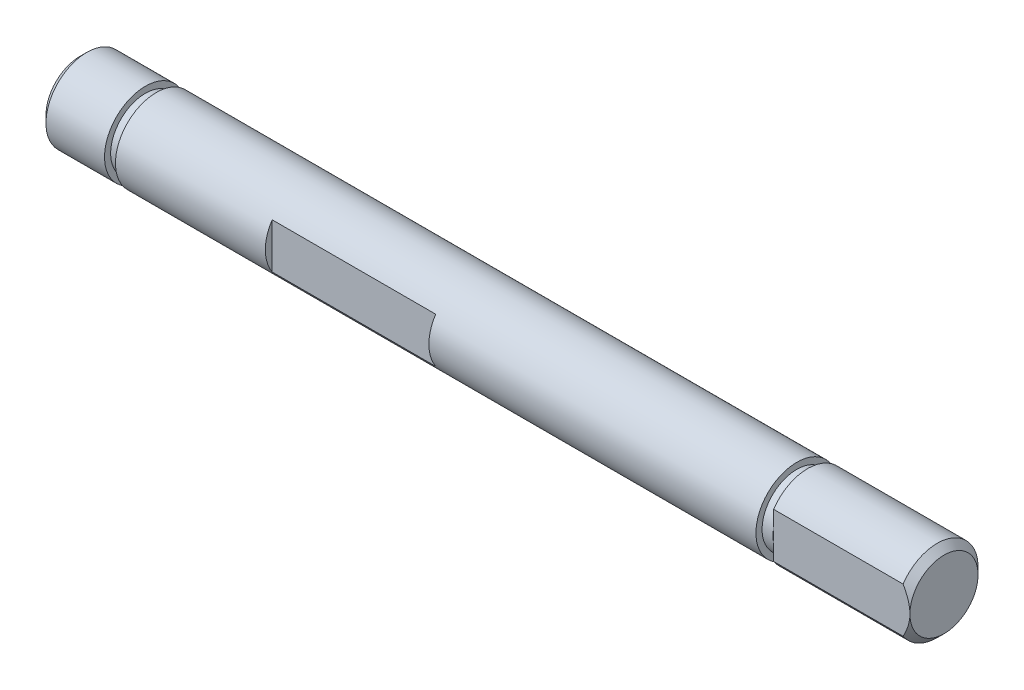
ISO-10303-21;
HEADER;
FILE_DESCRIPTION(('STEP AP214'),'2;1');
FILE_NAME('part.step','',(''),(''),'','','');
FILE_SCHEMA(('AUTOMOTIVE_DESIGN { 1 0 10303 214 1 1 1 1 }'));
ENDSEC;
DATA;
#1=APPLICATION_CONTEXT('core data for automotive mechanical design processes');
#2=APPLICATION_PROTOCOL_DEFINITION('international standard','automotive_design',2000,#1);
#3=PRODUCT_CONTEXT('',#1,'mechanical');
#4=PRODUCT('Part','Part','',(#3));
#5=PRODUCT_RELATED_PRODUCT_CATEGORY('part','',(#4));
#6=PRODUCT_DEFINITION_FORMATION('','',#4);
#7=PRODUCT_DEFINITION_CONTEXT('part definition',#1,'design');
#8=PRODUCT_DEFINITION('design','',#6,#7);
#9=PRODUCT_DEFINITION_SHAPE('','',#8);
#10=(LENGTH_UNIT() NAMED_UNIT(*) SI_UNIT(.MILLI.,.METRE.));
#11=(NAMED_UNIT(*) PLANE_ANGLE_UNIT() SI_UNIT($,.RADIAN.));
#12=(NAMED_UNIT(*) SI_UNIT($,.STERADIAN.) SOLID_ANGLE_UNIT());
#13=UNCERTAINTY_MEASURE_WITH_UNIT(LENGTH_MEASURE(1.E-05),#10,'distance_accuracy_value','');
#14=(GEOMETRIC_REPRESENTATION_CONTEXT(3) GLOBAL_UNCERTAINTY_ASSIGNED_CONTEXT((#13)) GLOBAL_UNIT_ASSIGNED_CONTEXT((#10,
#11,#12)) REPRESENTATION_CONTEXT('',''));
#15=CARTESIAN_POINT('',(0.,0.,0.));
#16=DIRECTION('',(0.,0.,1.));
#17=DIRECTION('',(1.,0.,0.));
#18=AXIS2_PLACEMENT_3D('',#15,#16,#17);
#19=CARTESIAN_POINT('',(31.7,0.,0.));
#20=DIRECTION('',(1.,0.,0.));
#21=DIRECTION('',(0.,0.,-1.));
#22=AXIS2_PLACEMENT_3D('',#19,#20,#21);
#23=CYLINDRICAL_SURFACE('',#22,3.);
#24=CARTESIAN_POINT('',(-26.1,0.,0.));
#25=DIRECTION('',(1.,0.,0.));
#26=DIRECTION('',(0.,0.,-1.));
#27=AXIS2_PLACEMENT_3D('',#24,#25,#26);
#28=CIRCLE('',#27,3.);
#29=CARTESIAN_POINT('',(-26.1,0.,-3.));
#30=VERTEX_POINT('',#29);
#31=EDGE_CURVE('E136',#30,#30,#28,.T.);
#32=ORIENTED_EDGE('',*,*,#31,.T.);
#33=EDGE_LOOP('',(#32));
#34=FACE_BOUND('',#33,.T.);
#35=CARTESIAN_POINT('',(20.9,0.,0.));
#36=DIRECTION('',(1.,0.,0.));
#37=DIRECTION('',(0.,0.,-1.));
#38=AXIS2_PLACEMENT_3D('',#35,#36,#37);
#39=CIRCLE('',#38,3.);
#40=CARTESIAN_POINT('',(20.9,0.,-3.));
#41=VERTEX_POINT('',#40);
#42=EDGE_CURVE('E139',#41,#41,#39,.T.);
#43=ORIENTED_EDGE('',*,*,#42,.F.);
#44=EDGE_LOOP('',(#43));
#45=FACE_BOUND('',#44,.T.);
#46=CARTESIAN_POINT('',(-15.1,0.,0.));
#47=DIRECTION('',(1.,0.,0.));
#48=DIRECTION('',(0.,0.,-1.));
#49=AXIS2_PLACEMENT_3D('',#46,#47,#48);
#50=CIRCLE('',#49,3.);
#51=CARTESIAN_POINT('',(-15.1,1.65831239519321,2.49999999999773));
#52=VERTEX_POINT('',#51);
#53=CARTESIAN_POINT('',(-15.1,-1.65831239519321,2.49999999999773));
#54=VERTEX_POINT('',#53);
#55=EDGE_CURVE('E98',#52,#54,#50,.T.);
#56=ORIENTED_EDGE('',*,*,#55,.F.);
#57=DIRECTION('',(1.,0.,0.));
#58=VECTOR('',#57,1.);
#59=CARTESIAN_POINT('',(-15.1,1.65831239519321,2.49999999999773));
#60=LINE('',#59,#58);
#61=CARTESIAN_POINT('',(-3.1,1.65831239519321,2.49999999999773));
#62=VERTEX_POINT('',#61);
#63=EDGE_CURVE('E110',#52,#62,#60,.T.);
#64=ORIENTED_EDGE('',*,*,#63,.T.);
#65=CARTESIAN_POINT('',(-3.1,0.,0.));
#66=DIRECTION('',(1.,0.,0.));
#67=DIRECTION('',(0.,0.,-1.));
#68=AXIS2_PLACEMENT_3D('',#65,#66,#67);
#69=CIRCLE('',#68,3.);
#70=CARTESIAN_POINT('',(-3.1,-1.65831239518952,2.49999999999216));
#71=VERTEX_POINT('',#70);
#72=EDGE_CURVE('E112',#62,#71,#69,.T.);
#73=ORIENTED_EDGE('',*,*,#72,.T.);
#74=DIRECTION('',(1.,0.,0.));
#75=VECTOR('',#74,1.);
#76=CARTESIAN_POINT('',(-15.1,-1.65831239519321,2.49999999999773));
#77=LINE('',#76,#75);
#78=EDGE_CURVE('E108',#54,#71,#77,.T.);
#79=ORIENTED_EDGE('',*,*,#78,.F.);
#80=EDGE_LOOP('',(#56,#64,#73,#79));
#81=FACE_BOUND('',#80,.T.);
#82=ADVANCED_FACE('F43',(#34,#45,#81),#23,.T.);
#83=CARTESIAN_POINT('',(31.7,0.,0.));
#84=DIRECTION('',(-1.,0.,0.));
#85=DIRECTION('',(0.,0.,1.));
#86=AXIS2_PLACEMENT_3D('',#83,#84,#85);
#87=PLANE('',#86);
#88=CARTESIAN_POINT('',(31.7,0.,0.));
#89=DIRECTION('',(-1.,0.,0.));
#90=DIRECTION('',(0.,0.,1.));
#91=AXIS2_PLACEMENT_3D('',#88,#89,#90);
#92=CIRCLE('',#91,2.49999999999999);
#93=CARTESIAN_POINT('',(31.7,0.,2.49999999999999));
#94=VERTEX_POINT('',#93);
#95=EDGE_CURVE('E157',#94,#94,#92,.F.);
#96=ORIENTED_EDGE('',*,*,#95,.T.);
#97=EDGE_LOOP('',(#96));
#98=FACE_BOUND('',#97,.T.);
#99=ADVANCED_FACE('F171',(#98),#87,.F.);
#100=CARTESIAN_POINT('',(31.7,0.,0.));
#101=DIRECTION('',(1.,0.,0.));
#102=DIRECTION('',(0.,0.,-1.));
#103=AXIS2_PLACEMENT_3D('',#100,#101,#102);
#104=CYLINDRICAL_SURFACE('',#103,3.);
#105=CARTESIAN_POINT('',(21.7,0.,0.));
#106=DIRECTION('',(1.,0.,0.));
#107=DIRECTION('',(0.,0.,-1.));
#108=AXIS2_PLACEMENT_3D('',#105,#106,#107);
#109=CIRCLE('',#108,3.);
#110=CARTESIAN_POINT('',(21.7,-1.6583123951777,2.5));
#111=VERTEX_POINT('',#110);
#112=CARTESIAN_POINT('',(21.7,1.6583123951777,2.5));
#113=VERTEX_POINT('',#112);
#114=EDGE_CURVE('E148',#111,#113,#109,.T.);
#115=ORIENTED_EDGE('',*,*,#114,.T.);
#116=DIRECTION('',(1.,0.,0.));
#117=VECTOR('',#116,1.);
#118=CARTESIAN_POINT('',(18.3458980337503,1.6583123951777,2.5));
#119=LINE('',#118,#117);
#120=CARTESIAN_POINT('',(31.2,1.6583123951777,2.5));
#121=VERTEX_POINT('',#120);
#122=EDGE_CURVE('E118',#113,#121,#119,.T.);
#123=ORIENTED_EDGE('',*,*,#122,.T.);
#124=CARTESIAN_POINT('',(31.2,0.,0.));
#125=DIRECTION('',(-1.,0.,0.));
#126=DIRECTION('',(0.,0.,1.));
#127=AXIS2_PLACEMENT_3D('',#124,#125,#126);
#128=CIRCLE('',#127,3.);
#129=CARTESIAN_POINT('',(31.2,-1.6583123951777,2.5));
#130=VERTEX_POINT('',#129);
#131=EDGE_CURVE('E159',#121,#130,#128,.T.);
#132=ORIENTED_EDGE('',*,*,#131,.T.);
#133=DIRECTION('',(1.,0.,0.));
#134=VECTOR('',#133,1.);
#135=CARTESIAN_POINT('',(18.3458980337503,-1.6583123951777,2.5));
#136=LINE('',#135,#134);
#137=EDGE_CURVE('E114',#111,#130,#136,.T.);
#138=ORIENTED_EDGE('',*,*,#137,.F.);
#139=EDGE_LOOP('',(#115,#123,#132,#138));
#140=FACE_BOUND('',#139,.T.);
#141=ADVANCED_FACE('F168',(#140),#104,.T.);
#142=CARTESIAN_POINT('',(21.7,0.,3.));
#143=DIRECTION('',(1.,0.,0.));
#144=DIRECTION('',(0.,0.,-1.));
#145=AXIS2_PLACEMENT_3D('',#142,#143,#144);
#146=PLANE('',#145);
#147=ORIENTED_EDGE('',*,*,#114,.F.);
#148=DIRECTION('',(0.,-1.,0.));
#149=VECTOR('',#148,1.);
#150=CARTESIAN_POINT('',(21.7,1.6583123951777,2.5));
#151=LINE('',#150,#149);
#152=CARTESIAN_POINT('',(21.7,-0.502493781056048,2.5));
#153=VERTEX_POINT('',#152);
#154=EDGE_CURVE('E121',#153,#111,#151,.T.);
#155=ORIENTED_EDGE('',*,*,#154,.F.);
#156=CARTESIAN_POINT('',(21.7,0.,0.));
#157=DIRECTION('',(1.,0.,0.));
#158=DIRECTION('',(0.,0.,-1.));
#159=AXIS2_PLACEMENT_3D('',#156,#157,#158);
#160=CIRCLE('',#159,2.55);
#161=CARTESIAN_POINT('',(21.7,0.502493781056048,2.5));
#162=VERTEX_POINT('',#161);
#163=EDGE_CURVE('E145',#153,#162,#160,.T.);
#164=ORIENTED_EDGE('',*,*,#163,.T.);
#165=EDGE_CURVE('E123',#113,#162,#151,.T.);
#166=ORIENTED_EDGE('',*,*,#165,.F.);
#167=EDGE_LOOP('',(#147,#155,#164,#166));
#168=FACE_BOUND('',#167,.T.);
#169=ADVANCED_FACE('F178',(#168),#146,.F.);
#170=CARTESIAN_POINT('',(31.7,0.,0.));
#171=DIRECTION('',(1.,0.,0.));
#172=DIRECTION('',(0.,0.,-1.));
#173=AXIS2_PLACEMENT_3D('',#170,#171,#172);
#174=CYLINDRICAL_SURFACE('',#173,2.55);
#175=EDGE_CURVE('E146',#162,#153,#160,.T.);
#176=ORIENTED_EDGE('',*,*,#175,.F.);
#177=ORIENTED_EDGE('',*,*,#163,.F.);
#178=EDGE_LOOP('',(#176,#177));
#179=FACE_BOUND('',#178,.T.);
#180=CARTESIAN_POINT('',(20.9,0.,0.));
#181=DIRECTION('',(1.,0.,0.));
#182=DIRECTION('',(0.,0.,-1.));
#183=AXIS2_PLACEMENT_3D('',#180,#181,#182);
#184=CIRCLE('',#183,2.55);
#185=CARTESIAN_POINT('',(20.9,0.,-2.55));
#186=VERTEX_POINT('',#185);
#187=EDGE_CURVE('E142',#186,#186,#184,.T.);
#188=ORIENTED_EDGE('',*,*,#187,.T.);
#189=EDGE_LOOP('',(#188));
#190=FACE_BOUND('',#189,.T.);
#191=ADVANCED_FACE('F226',(#179,#190),#174,.T.);
#192=CARTESIAN_POINT('',(20.9,0.,2.55));
#193=DIRECTION('',(-1.,0.,0.));
#194=DIRECTION('',(0.,0.,1.));
#195=AXIS2_PLACEMENT_3D('',#192,#193,#194);
#196=PLANE('',#195);
#197=ORIENTED_EDGE('',*,*,#187,.F.);
#198=EDGE_LOOP('',(#197));
#199=FACE_BOUND('',#198,.T.);
#200=ORIENTED_EDGE('',*,*,#42,.T.);
#201=EDGE_LOOP('',(#200));
#202=FACE_BOUND('',#201,.T.);
#203=ADVANCED_FACE('F221',(#199,#202),#196,.F.);
#204=CARTESIAN_POINT('',(-26.1,0.,3.));
#205=DIRECTION('',(1.,0.,0.));
#206=DIRECTION('',(0.,0.,-1.));
#207=AXIS2_PLACEMENT_3D('',#204,#205,#206);
#208=PLANE('',#207);
#209=ORIENTED_EDGE('',*,*,#31,.F.);
#210=EDGE_LOOP('',(#209));
#211=FACE_BOUND('',#210,.T.);
#212=CARTESIAN_POINT('',(-26.1,0.,0.));
#213=DIRECTION('',(1.,0.,0.));
#214=DIRECTION('',(0.,0.,-1.));
#215=AXIS2_PLACEMENT_3D('',#212,#213,#214);
#216=CIRCLE('',#215,2.55);
#217=CARTESIAN_POINT('',(-26.1,0.,-2.55));
#218=VERTEX_POINT('',#217);
#219=EDGE_CURVE('E133',#218,#218,#216,.T.);
#220=ORIENTED_EDGE('',*,*,#219,.T.);
#221=EDGE_LOOP('',(#220));
#222=FACE_BOUND('',#221,.T.);
#223=ADVANCED_FACE('F215',(#211,#222),#208,.F.);
#224=CARTESIAN_POINT('',(31.7,0.,0.));
#225=DIRECTION('',(1.,0.,0.));
#226=DIRECTION('',(0.,0.,-1.));
#227=AXIS2_PLACEMENT_3D('',#224,#225,#226);
#228=CYLINDRICAL_SURFACE('',#227,2.55);
#229=ORIENTED_EDGE('',*,*,#219,.F.);
#230=EDGE_LOOP('',(#229));
#231=FACE_BOUND('',#230,.T.);
#232=CARTESIAN_POINT('',(-26.9,0.,0.));
#233=DIRECTION('',(1.,0.,0.));
#234=DIRECTION('',(0.,0.,-1.));
#235=AXIS2_PLACEMENT_3D('',#232,#233,#234);
#236=CIRCLE('',#235,2.55);
#237=CARTESIAN_POINT('',(-26.9,0.,-2.55));
#238=VERTEX_POINT('',#237);
#239=EDGE_CURVE('E130',#238,#238,#236,.T.);
#240=ORIENTED_EDGE('',*,*,#239,.T.);
#241=EDGE_LOOP('',(#240));
#242=FACE_BOUND('',#241,.T.);
#243=ADVANCED_FACE('F209',(#231,#242),#228,.T.);
#244=CARTESIAN_POINT('',(-26.9,0.,2.55));
#245=DIRECTION('',(-1.,0.,0.));
#246=DIRECTION('',(0.,0.,1.));
#247=AXIS2_PLACEMENT_3D('',#244,#245,#246);
#248=PLANE('',#247);
#249=ORIENTED_EDGE('',*,*,#239,.F.);
#250=EDGE_LOOP('',(#249));
#251=FACE_BOUND('',#250,.T.);
#252=CARTESIAN_POINT('',(-26.9,0.,0.));
#253=DIRECTION('',(1.,0.,0.));
#254=DIRECTION('',(0.,0.,-1.));
#255=AXIS2_PLACEMENT_3D('',#252,#253,#254);
#256=CIRCLE('',#255,3.);
#257=CARTESIAN_POINT('',(-26.9,0.,-3.));
#258=VERTEX_POINT('',#257);
#259=EDGE_CURVE('E126',#258,#258,#256,.T.);
#260=ORIENTED_EDGE('',*,*,#259,.T.);
#261=EDGE_LOOP('',(#260));
#262=FACE_BOUND('',#261,.T.);
#263=ADVANCED_FACE('F204',(#251,#262),#248,.F.);
#264=CARTESIAN_POINT('',(31.7,0.,0.));
#265=DIRECTION('',(1.,0.,0.));
#266=DIRECTION('',(0.,0.,-1.));
#267=AXIS2_PLACEMENT_3D('',#264,#265,#266);
#268=CYLINDRICAL_SURFACE('',#267,3.);
#269=CARTESIAN_POINT('',(-31.2,0.,0.));
#270=DIRECTION('',(1.,0.,0.));
#271=DIRECTION('',(0.,0.,-1.));
#272=AXIS2_PLACEMENT_3D('',#269,#270,#271);
#273=CIRCLE('',#272,3.);
#274=CARTESIAN_POINT('',(-31.2,0.,-3.));
#275=VERTEX_POINT('',#274);
#276=EDGE_CURVE('E151',#275,#275,#273,.T.);
#277=ORIENTED_EDGE('',*,*,#276,.T.);
#278=EDGE_LOOP('',(#277));
#279=FACE_BOUND('',#278,.T.);
#280=ORIENTED_EDGE('',*,*,#259,.F.);
#281=EDGE_LOOP('',(#280));
#282=FACE_BOUND('',#281,.T.);
#283=ADVANCED_FACE('F195',(#279,#282),#268,.T.);
#284=CARTESIAN_POINT('',(-31.7,0.,3.));
#285=DIRECTION('',(1.,0.,0.));
#286=DIRECTION('',(0.,0.,-1.));
#287=AXIS2_PLACEMENT_3D('',#284,#285,#286);
#288=PLANE('',#287);
#289=CARTESIAN_POINT('',(-31.7,0.,0.));
#290=DIRECTION('',(1.,0.,0.));
#291=DIRECTION('',(0.,0.,-1.));
#292=AXIS2_PLACEMENT_3D('',#289,#290,#291);
#293=CIRCLE('',#292,2.49999999999999);
#294=CARTESIAN_POINT('',(-31.7,0.,-2.49999999999999));
#295=VERTEX_POINT('',#294);
#296=EDGE_CURVE('E154',#295,#295,#293,.F.);
#297=ORIENTED_EDGE('',*,*,#296,.T.);
#298=EDGE_LOOP('',(#297));
#299=FACE_BOUND('',#298,.T.);
#300=ADVANCED_FACE('F188',(#299),#288,.F.);
#301=CARTESIAN_POINT('',(-31.2,0.,0.));
#302=DIRECTION('',(1.,0.,0.));
#303=DIRECTION('',(0.,0.,-1.));
#304=AXIS2_PLACEMENT_3D('',#301,#302,#303);
#305=CONICAL_SURFACE('',#304,3.,0.785398163397446);
#306=ORIENTED_EDGE('',*,*,#296,.F.);
#307=EDGE_LOOP('',(#306));
#308=FACE_BOUND('',#307,.T.);
#309=ORIENTED_EDGE('',*,*,#276,.F.);
#310=EDGE_LOOP('',(#309));
#311=FACE_BOUND('',#310,.T.);
#312=ADVANCED_FACE('F185',(#308,#311),#305,.T.);
#313=CARTESIAN_POINT('',(31.7,0.,0.));
#314=DIRECTION('',(-1.,0.,0.));
#315=DIRECTION('',(0.,0.,1.));
#316=AXIS2_PLACEMENT_3D('',#313,#314,#315);
#317=CONICAL_SURFACE('',#316,2.49999999999999,0.785398163397453);
#318=CARTESIAN_POINT('',(28.598544587664,-5.01261436142739,2.5));
#319=CARTESIAN_POINT('',(28.7292961898362,-4.86645601073501,2.5));
#320=CARTESIAN_POINT('',(28.8594638313863,-4.71976739212954,2.5));
#321=CARTESIAN_POINT('',(29.1182043366285,-4.42490323608813,2.5));
#322=CARTESIAN_POINT('',(29.2467766411769,-4.27672720851474,2.5));
#323=CARTESIAN_POINT('',(29.5032395004087,-3.97688951525237,2.5));
#324=CARTESIAN_POINT('',(29.6311062482402,-3.82520739562326,2.5));
#325=CARTESIAN_POINT('',(29.8206791885024,-3.59587157248299,2.5));
#326=CARTESIAN_POINT('',(29.883492074651,-3.51913287021473,2.5));
#327=CARTESIAN_POINT('',(30.0082494078658,-3.36494027001332,2.5));
#328=CARTESIAN_POINT('',(30.070193765036,-3.28748629940352,2.5));
#329=CARTESIAN_POINT('',(30.2460483302526,-3.06459082343302,2.5));
#330=CARTESIAN_POINT('',(30.3586894981081,-2.91813907352298,2.5));
#331=CARTESIAN_POINT('',(30.5788996641048,-2.62149769559911,2.5));
#332=CARTESIAN_POINT('',(30.6864696419384,-2.47130879819322,2.5));
#333=CARTESIAN_POINT('',(30.8940169575575,-2.16612182513485,2.5));
#334=CARTESIAN_POINT('',(30.9940093878101,-2.01113422400727,2.5));
#335=CARTESIAN_POINT('',(31.1354107270732,-1.77361367684957,2.5));
#336=CARTESIAN_POINT('',(31.1810970794498,-1.69363260464487,2.5));
#337=CARTESIAN_POINT('',(31.2688677372138,-1.53172298488916,2.5));
#338=CARTESIAN_POINT('',(31.3109528053295,-1.44979485443235,2.5));
#339=CARTESIAN_POINT('',(31.3878183587141,-1.28955485758684,2.5));
#340=CARTESIAN_POINT('',(31.4229037691546,-1.21139031158101,2.5));
#341=CARTESIAN_POINT('',(31.488230570901,-1.05304035275104,2.5));
#342=CARTESIAN_POINT('',(31.5184719361588,-0.972854929062609,2.5));
#343=CARTESIAN_POINT('',(31.5729031977163,-0.810820527838519,2.5));
#344=CARTESIAN_POINT('',(31.5971190319419,-0.728980380152396,2.5));
#345=CARTESIAN_POINT('',(31.6385195500288,-0.563547709814035,2.5));
#346=CARTESIAN_POINT('',(31.6557071011351,-0.479955916420191,2.5));
#347=CARTESIAN_POINT('',(31.6822646083775,-0.310064383761517,2.5));
#348=CARTESIAN_POINT('',(31.6914974735762,-0.223742755772615,2.5));
#349=CARTESIAN_POINT('',(31.7009812764121,-0.0506093366638322,2.5));
#350=CARTESIAN_POINT('',(31.7012334603241,0.0362023847720708,2.5));
#351=CARTESIAN_POINT('',(31.6927321484853,0.209521762519747,2.5));
#352=CARTESIAN_POINT('',(31.6839634825484,0.296028660341596,2.5));
#353=CARTESIAN_POINT('',(31.6580338915021,0.467771425777416,2.5));
#354=CARTESIAN_POINT('',(31.6408705066054,0.553006913299571,2.5));
#355=CARTESIAN_POINT('',(31.5938594777731,0.743317468333404,2.5));
#356=CARTESIAN_POINT('',(31.5618857477942,0.847862483412583,2.5));
#357=CARTESIAN_POINT('',(31.4887422005432,1.05365832245568,2.5));
#358=CARTESIAN_POINT('',(31.4475678392535,1.15490749025714,2.5));
#359=CARTESIAN_POINT('',(31.357667077102,1.35535095839278,2.5));
#360=CARTESIAN_POINT('',(31.3088593227963,1.45450827052738,2.5));
#361=CARTESIAN_POINT('',(31.2058001956105,1.64988097548432,2.5));
#362=CARTESIAN_POINT('',(31.1515503446907,1.74609718106266,2.5));
#363=CARTESIAN_POINT('',(31.0060900856273,1.99142704465457,2.5));
#364=CARTESIAN_POINT('',(30.911766898266,2.13868543535042,2.5));
#365=CARTESIAN_POINT('',(30.7162335666569,2.42858701671763,2.5));
#366=CARTESIAN_POINT('',(30.615019822545,2.57122773664616,2.5));
#367=CARTESIAN_POINT('',(30.4076005635745,2.85332108896268,2.5));
#368=CARTESIAN_POINT('',(30.3013840508022,2.99276558976203,2.5));
#369=CARTESIAN_POINT('',(30.0855313873053,3.26898529959988,2.5));
#370=CARTESIAN_POINT('',(29.9758949548956,3.40576028724498,2.5));
#371=CARTESIAN_POINT('',(29.7623603367655,3.66713566496969,2.5));
#372=CARTESIAN_POINT('',(29.6586428413258,3.79188417485759,2.5));
#373=CARTESIAN_POINT('',(29.4495294376333,4.03997782587901,2.5));
#374=CARTESIAN_POINT('',(29.3441334188187,4.1633228736435,2.5));
#375=CARTESIAN_POINT('',(29.1326215107457,4.40818765481887,2.5));
#376=CARTESIAN_POINT('',(29.0265129639386,4.52971374327954,2.5));
#377=CARTESIAN_POINT('',(28.8132532405992,4.77182042249177,2.5));
#378=CARTESIAN_POINT('',(28.7061022001604,4.89240113304366,2.5));
#379=CARTESIAN_POINT('',(28.598544587664,5.01261436142739,2.5));
#380=B_SPLINE_CURVE_WITH_KNOTS('',3,(#318,#319,#320,#321,#322,#323,#324,#325,#326,#327,#328,
#329,#330,#331,#332,#333,#334,#335,#336,#337,#338,#339,#340,#341,#342,#343,#344,#345,#346,#347,
#348,#349,#350,#351,#352,#353,#354,#355,#356,#357,#358,#359,#360,#361,#362,#363,#364,#365,#366,
#367,#368,#369,#370,#371,#372,#373,#374,#375,#376,#377,#378,#379),.UNSPECIFIED.,.F.,.F.,(4,2,2,
2,2,2,2,2,2,2,2,2,2,2,2,2,2,2,2,2,2,2,2,2,2,2,2,2,2,2,4),(0.,0.588329986418017,1.17686065921619,
1.7719900012701,2.06948816889886,2.36701690466704,2.92121182530221,3.47529923975523,
4.02825235410285,4.30451265967421,4.58071430956077,4.83761667037549,5.09452041259713,
5.35029835461559,5.60597184559854,5.86596818653911,6.1259284469096,6.3863265931115,
6.64680108589991,6.97420780536853,7.30177658362062,7.63310993802639,7.96435088727171,
8.48865866228518,9.01324248750309,9.53903891418246,10.0648787635414,10.5515594246363,
11.0382722763362,11.5222580103924,12.006181387876),.UNSPECIFIED.);
#381=EDGE_CURVE('E11',#130,#94,#380,.T.);
#382=ORIENTED_EDGE('',*,*,#381,.F.);
#383=ORIENTED_EDGE('',*,*,#131,.F.);
#384=EDGE_CURVE('E49',#94,#121,#380,.T.);
#385=ORIENTED_EDGE('',*,*,#384,.F.);
#386=ORIENTED_EDGE('',*,*,#95,.F.);
#387=EDGE_LOOP('',(#382,#383,#385,#386));
#388=FACE_BOUND('',#387,.T.);
#389=ADVANCED_FACE('F46',(#388),#317,.T.);
#390=CARTESIAN_POINT('',(21.7,0.,3.));
#391=DIRECTION('',(1.,0.,0.));
#392=DIRECTION('',(0.,0.,-1.));
#393=AXIS2_PLACEMENT_3D('',#390,#391,#392);
#394=PLANE('',#393);
#395=ORIENTED_EDGE('',*,*,#175,.T.);
#396=EDGE_CURVE('E127',#162,#153,#151,.T.);
#397=ORIENTED_EDGE('',*,*,#396,.F.);
#398=EDGE_LOOP('',(#395,#397));
#399=FACE_BOUND('',#398,.T.);
#400=ADVANCED_FACE('F194',(#399),#394,.T.);
#401=CARTESIAN_POINT('',(18.3458980337503,1.6583123951777,2.5));
#402=DIRECTION('',(0.,0.,-1.));
#403=DIRECTION('',(-1.,0.,0.));
#404=AXIS2_PLACEMENT_3D('',#401,#402,#403);
#405=PLANE('',#404);
#406=ORIENTED_EDGE('',*,*,#381,.T.);
#407=ORIENTED_EDGE('',*,*,#384,.T.);
#408=ORIENTED_EDGE('',*,*,#122,.F.);
#409=ORIENTED_EDGE('',*,*,#165,.T.);
#410=ORIENTED_EDGE('',*,*,#396,.T.);
#411=ORIENTED_EDGE('',*,*,#154,.T.);
#412=ORIENTED_EDGE('',*,*,#137,.T.);
#413=EDGE_LOOP('',(#406,#407,#408,#409,#410,#411,#412));
#414=FACE_BOUND('',#413,.T.);
#415=ADVANCED_FACE('F164',(#414),#405,.F.);
#416=CARTESIAN_POINT('',(-15.1,-291595.6,2.49999999999773));
#417=DIRECTION('',(0.,0.,-1.));
#418=DIRECTION('',(-1.,0.,0.));
#419=AXIS2_PLACEMENT_3D('',#416,#417,#418);
#420=PLANE('',#419);
#421=DIRECTION('',(0.,1.,0.));
#422=VECTOR('',#421,1.);
#423=CARTESIAN_POINT('',(-3.1,-291595.6,2.49999999999773));
#424=LINE('',#423,#422);
#425=EDGE_CURVE('E64',#71,#62,#424,.T.);
#426=ORIENTED_EDGE('',*,*,#425,.T.);
#427=ORIENTED_EDGE('',*,*,#63,.F.);
#428=DIRECTION('',(0.,1.,0.));
#429=VECTOR('',#428,1.);
#430=CARTESIAN_POINT('',(-15.1,-291595.6,2.49999999999773));
#431=LINE('',#430,#429);
#432=EDGE_CURVE('E101',#54,#52,#431,.T.);
#433=ORIENTED_EDGE('',*,*,#432,.F.);
#434=ORIENTED_EDGE('',*,*,#78,.T.);
#435=EDGE_LOOP('',(#426,#427,#433,#434));
#436=FACE_BOUND('',#435,.T.);
#437=ADVANCED_FACE('F107',(#436),#420,.F.);
#438=CARTESIAN_POINT('',(-15.1,0.,0.));
#439=DIRECTION('',(1.,0.,0.));
#440=DIRECTION('',(0.,0.,-1.));
#441=AXIS2_PLACEMENT_3D('',#438,#439,#440);
#442=PLANE('',#441);
#443=ORIENTED_EDGE('',*,*,#55,.T.);
#444=ORIENTED_EDGE('',*,*,#432,.T.);
#445=EDGE_LOOP('',(#443,#444));
#446=FACE_BOUND('',#445,.T.);
#447=ADVANCED_FACE('F100',(#446),#442,.T.);
#448=CARTESIAN_POINT('',(-3.1,0.,0.));
#449=DIRECTION('',(1.,0.,0.));
#450=DIRECTION('',(0.,0.,-1.));
#451=AXIS2_PLACEMENT_3D('',#448,#449,#450);
#452=PLANE('',#451);
#453=ORIENTED_EDGE('',*,*,#72,.F.);
#454=ORIENTED_EDGE('',*,*,#425,.F.);
#455=EDGE_LOOP('',(#453,#454));
#456=FACE_BOUND('',#455,.T.);
#457=ADVANCED_FACE('F254',(#456),#452,.F.);
#458=CLOSED_SHELL('',(#82,#99,#141,#169,#191,#203,#223,#243,#263,#283,#300,#312,#389,#400,#415,
#437,#447,#457));
#459=MANIFOLD_SOLID_BREP('B2',#458);
#460=ADVANCED_BREP_SHAPE_REPRESENTATION('',(#18,#459),#14);
#461=SHAPE_DEFINITION_REPRESENTATION(#9,#460);
ENDSEC;
END-ISO-10303-21;
